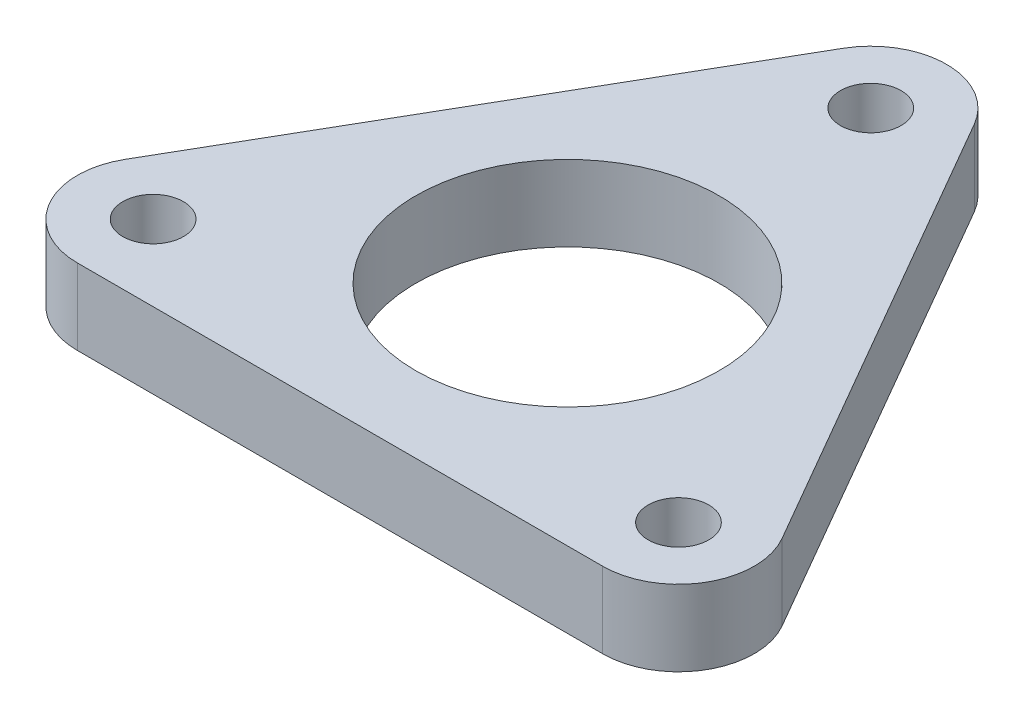
ISO-10303-21;
HEADER;
FILE_DESCRIPTION(('STEP AP214'),'2;1');
FILE_NAME('part.step','',(''),(''),'','','');
FILE_SCHEMA(('AUTOMOTIVE_DESIGN { 1 0 10303 214 1 1 1 1 }'));
ENDSEC;
DATA;
#1=APPLICATION_CONTEXT('core data for automotive mechanical design processes');
#2=APPLICATION_PROTOCOL_DEFINITION('international standard','automotive_design',2000,#1);
#3=PRODUCT_CONTEXT('',#1,'mechanical');
#4=PRODUCT('Part','Part','',(#3));
#5=PRODUCT_RELATED_PRODUCT_CATEGORY('part','',(#4));
#6=PRODUCT_DEFINITION_FORMATION('','',#4);
#7=PRODUCT_DEFINITION_CONTEXT('part definition',#1,'design');
#8=PRODUCT_DEFINITION('design','',#6,#7);
#9=PRODUCT_DEFINITION_SHAPE('','',#8);
#10=(LENGTH_UNIT() NAMED_UNIT(*) SI_UNIT(.MILLI.,.METRE.));
#11=(NAMED_UNIT(*) PLANE_ANGLE_UNIT() SI_UNIT($,.RADIAN.));
#12=(NAMED_UNIT(*) SI_UNIT($,.STERADIAN.) SOLID_ANGLE_UNIT());
#13=UNCERTAINTY_MEASURE_WITH_UNIT(LENGTH_MEASURE(1.E-05),#10,'distance_accuracy_value','');
#14=(GEOMETRIC_REPRESENTATION_CONTEXT(3) GLOBAL_UNCERTAINTY_ASSIGNED_CONTEXT((#13)) GLOBAL_UNIT_ASSIGNED_CONTEXT((#10,
#11,#12)) REPRESENTATION_CONTEXT('',''));
#15=CARTESIAN_POINT('',(0.,0.,0.));
#16=DIRECTION('',(0.,0.,1.));
#17=DIRECTION('',(1.,0.,0.));
#18=AXIS2_PLACEMENT_3D('',#15,#16,#17);
#19=CARTESIAN_POINT('',(34.6410161513775,10.,20.0000000000001));
#20=DIRECTION('',(0.,-1.,0.));
#21=DIRECTION('',(0.,0.,-1.));
#22=AXIS2_PLACEMENT_3D('',#19,#20,#21);
#23=CYLINDRICAL_SURFACE('',#22,10.);
#24=CARTESIAN_POINT('',(34.6410161513775,0.,20.0000000000001));
#25=DIRECTION('',(0.,1.,0.));
#26=DIRECTION('',(0.,0.,1.));
#27=AXIS2_PLACEMENT_3D('',#24,#25,#26);
#28=CIRCLE('',#27,10.);
#29=CARTESIAN_POINT('',(34.6410161513775,0.,30.0000000000001));
#30=VERTEX_POINT('',#29);
#31=CARTESIAN_POINT('',(43.3012701892219,0.,15.0000000000001));
#32=VERTEX_POINT('',#31);
#33=EDGE_CURVE('E129',#30,#32,#28,.T.);
#34=ORIENTED_EDGE('',*,*,#33,.T.);
#35=DIRECTION('',(0.,-1.,0.));
#36=VECTOR('',#35,1.);
#37=CARTESIAN_POINT('',(43.3012701892219,10.,15.0000000000001));
#38=LINE('',#37,#36);
#39=CARTESIAN_POINT('',(43.3012701892219,10.,15.0000000000001));
#40=VERTEX_POINT('',#39);
#41=EDGE_CURVE('E11',#40,#32,#38,.T.);
#42=ORIENTED_EDGE('',*,*,#41,.F.);
#43=CARTESIAN_POINT('',(34.6410161513775,10.,20.0000000000001));
#44=DIRECTION('',(0.,1.,0.));
#45=DIRECTION('',(0.,0.,1.));
#46=AXIS2_PLACEMENT_3D('',#43,#44,#45);
#47=CIRCLE('',#46,10.);
#48=CARTESIAN_POINT('',(34.6410161513775,10.,30.0000000000001));
#49=VERTEX_POINT('',#48);
#50=EDGE_CURVE('E81',#49,#40,#47,.T.);
#51=ORIENTED_EDGE('',*,*,#50,.F.);
#52=DIRECTION('',(0.,-1.,0.));
#53=VECTOR('',#52,1.);
#54=CARTESIAN_POINT('',(34.6410161513775,10.,30.0000000000001));
#55=LINE('',#54,#53);
#56=EDGE_CURVE('E128',#49,#30,#55,.T.);
#57=ORIENTED_EDGE('',*,*,#56,.T.);
#58=EDGE_LOOP('',(#34,#42,#51,#57));
#59=FACE_BOUND('',#58,.T.);
#60=ADVANCED_FACE('F35',(#59),#23,.T.);
#61=CARTESIAN_POINT('',(25.9807621135331,10.,-15.));
#62=DIRECTION('',(0.866025403784439,0.,-0.499999999999999));
#63=DIRECTION('',(-0.499999999999999,0.,-0.866025403784439));
#64=AXIS2_PLACEMENT_3D('',#61,#62,#63);
#65=PLANE('',#64);
#66=DIRECTION('',(0.499999999999999,0.,0.866025403784439));
#67=VECTOR('',#66,1.);
#68=CARTESIAN_POINT('',(25.9807621135331,0.,-15.));
#69=LINE('',#68,#67);
#70=CARTESIAN_POINT('',(8.66025403784438,0.,-45.));
#71=VERTEX_POINT('',#70);
#72=EDGE_CURVE('E132',#71,#32,#69,.T.);
#73=ORIENTED_EDGE('',*,*,#72,.F.);
#74=DIRECTION('',(0.,-1.,0.));
#75=VECTOR('',#74,1.);
#76=CARTESIAN_POINT('',(8.66025403784438,10.,-45.));
#77=LINE('',#76,#75);
#78=CARTESIAN_POINT('',(8.66025403784438,10.,-45.));
#79=VERTEX_POINT('',#78);
#80=EDGE_CURVE('E43',#79,#71,#77,.T.);
#81=ORIENTED_EDGE('',*,*,#80,.F.);
#82=DIRECTION('',(0.499999999999999,0.,0.866025403784439));
#83=VECTOR('',#82,1.);
#84=CARTESIAN_POINT('',(25.9807621135331,10.,-15.));
#85=LINE('',#84,#83);
#86=EDGE_CURVE('E337',#79,#40,#85,.T.);
#87=ORIENTED_EDGE('',*,*,#86,.T.);
#88=ORIENTED_EDGE('',*,*,#41,.T.);
#89=EDGE_LOOP('',(#73,#81,#87,#88));
#90=FACE_BOUND('',#89,.T.);
#91=ADVANCED_FACE('F162',(#90),#65,.T.);
#92=CARTESIAN_POINT('',(0.,10.,-40.));
#93=DIRECTION('',(0.,-1.,0.));
#94=DIRECTION('',(0.,0.,-1.));
#95=AXIS2_PLACEMENT_3D('',#92,#93,#94);
#96=CYLINDRICAL_SURFACE('',#95,9.99999999999999);
#97=CARTESIAN_POINT('',(0.,0.,-40.));
#98=DIRECTION('',(0.,1.,0.));
#99=DIRECTION('',(0.,0.,1.));
#100=AXIS2_PLACEMENT_3D('',#97,#98,#99);
#101=CIRCLE('',#100,9.99999999999999);
#102=CARTESIAN_POINT('',(-8.66025403784438,0.,-45.));
#103=VERTEX_POINT('',#102);
#104=EDGE_CURVE('E135',#103,#71,#101,.F.);
#105=ORIENTED_EDGE('',*,*,#104,.F.);
#106=DIRECTION('',(0.,-1.,0.));
#107=VECTOR('',#106,1.);
#108=CARTESIAN_POINT('',(-8.66025403784438,10.,-45.));
#109=LINE('',#108,#107);
#110=CARTESIAN_POINT('',(-8.66025403784438,10.,-45.));
#111=VERTEX_POINT('',#110);
#112=EDGE_CURVE('E102',#111,#103,#109,.T.);
#113=ORIENTED_EDGE('',*,*,#112,.F.);
#114=CARTESIAN_POINT('',(0.,10.,-40.));
#115=DIRECTION('',(0.,1.,0.));
#116=DIRECTION('',(0.,0.,1.));
#117=AXIS2_PLACEMENT_3D('',#114,#115,#116);
#118=CIRCLE('',#117,9.99999999999999);
#119=EDGE_CURVE('E109',#111,#79,#118,.F.);
#120=ORIENTED_EDGE('',*,*,#119,.T.);
#121=ORIENTED_EDGE('',*,*,#80,.T.);
#122=EDGE_LOOP('',(#105,#113,#120,#121));
#123=FACE_BOUND('',#122,.T.);
#124=ADVANCED_FACE('F159',(#123),#96,.T.);
#125=CARTESIAN_POINT('',(-25.9807621135332,10.,-15.));
#126=DIRECTION('',(-0.866025403784438,0.,-0.500000000000001));
#127=DIRECTION('',(-0.500000000000001,0.,0.866025403784438));
#128=AXIS2_PLACEMENT_3D('',#125,#126,#127);
#129=PLANE('',#128);
#130=DIRECTION('',(0.500000000000001,0.,-0.866025403784438));
#131=VECTOR('',#130,1.);
#132=CARTESIAN_POINT('',(-25.9807621135332,0.,-15.));
#133=LINE('',#132,#131);
#134=CARTESIAN_POINT('',(-43.301270189222,0.,15.));
#135=VERTEX_POINT('',#134);
#136=EDGE_CURVE('E97',#135,#103,#133,.T.);
#137=ORIENTED_EDGE('',*,*,#136,.F.);
#138=DIRECTION('',(0.,-1.,0.));
#139=VECTOR('',#138,1.);
#140=CARTESIAN_POINT('',(-43.301270189222,10.,15.));
#141=LINE('',#140,#139);
#142=CARTESIAN_POINT('',(-43.301270189222,10.,15.));
#143=VERTEX_POINT('',#142);
#144=EDGE_CURVE('E92',#143,#135,#141,.T.);
#145=ORIENTED_EDGE('',*,*,#144,.F.);
#146=DIRECTION('',(0.500000000000001,0.,-0.866025403784438));
#147=VECTOR('',#146,1.);
#148=CARTESIAN_POINT('',(-25.9807621135332,10.,-15.));
#149=LINE('',#148,#147);
#150=EDGE_CURVE('E95',#143,#111,#149,.T.);
#151=ORIENTED_EDGE('',*,*,#150,.T.);
#152=ORIENTED_EDGE('',*,*,#112,.T.);
#153=EDGE_LOOP('',(#137,#145,#151,#152));
#154=FACE_BOUND('',#153,.T.);
#155=ADVANCED_FACE('F94',(#154),#129,.T.);
#156=CARTESIAN_POINT('',(-34.6410161513775,10.,20.0000000000001));
#157=DIRECTION('',(0.,-1.,0.));
#158=DIRECTION('',(0.,0.,-1.));
#159=AXIS2_PLACEMENT_3D('',#156,#157,#158);
#160=CYLINDRICAL_SURFACE('',#159,10.0000000000001);
#161=CARTESIAN_POINT('',(-34.6410161513775,0.,20.0000000000001));
#162=DIRECTION('',(0.,1.,0.));
#163=DIRECTION('',(0.,0.,1.));
#164=AXIS2_PLACEMENT_3D('',#161,#162,#163);
#165=CIRCLE('',#164,10.0000000000001);
#166=CARTESIAN_POINT('',(-34.6410161513776,0.,30.0000000000001));
#167=VERTEX_POINT('',#166);
#168=EDGE_CURVE('E139',#167,#135,#165,.F.);
#169=ORIENTED_EDGE('',*,*,#168,.F.);
#170=DIRECTION('',(0.,-1.,0.));
#171=VECTOR('',#170,1.);
#172=CARTESIAN_POINT('',(-34.6410161513776,10.,30.0000000000001));
#173=LINE('',#172,#171);
#174=CARTESIAN_POINT('',(-34.6410161513776,10.,30.0000000000001));
#175=VERTEX_POINT('',#174);
#176=EDGE_CURVE('E72',#175,#167,#173,.T.);
#177=ORIENTED_EDGE('',*,*,#176,.F.);
#178=CARTESIAN_POINT('',(-34.6410161513775,10.,20.0000000000001));
#179=DIRECTION('',(0.,1.,0.));
#180=DIRECTION('',(0.,0.,1.));
#181=AXIS2_PLACEMENT_3D('',#178,#179,#180);
#182=CIRCLE('',#181,10.0000000000001);
#183=EDGE_CURVE('E107',#175,#143,#182,.F.);
#184=ORIENTED_EDGE('',*,*,#183,.T.);
#185=ORIENTED_EDGE('',*,*,#144,.T.);
#186=EDGE_LOOP('',(#169,#177,#184,#185));
#187=FACE_BOUND('',#186,.T.);
#188=ADVANCED_FACE('F111',(#187),#160,.T.);
#189=CARTESIAN_POINT('',(34.6410161513775,10.,20.0000000000001));
#190=DIRECTION('',(0.,-1.,0.));
#191=DIRECTION('',(0.,0.,-1.));
#192=AXIS2_PLACEMENT_3D('',#189,#190,#191);
#193=CYLINDRICAL_SURFACE('',#192,4.00000000000004);
#194=CARTESIAN_POINT('',(34.6410161513775,10.,20.0000000000001));
#195=DIRECTION('',(0.,1.,0.));
#196=DIRECTION('',(0.,0.,1.));
#197=AXIS2_PLACEMENT_3D('',#194,#195,#196);
#198=CIRCLE('',#197,4.00000000000004);
#199=CARTESIAN_POINT('',(34.6410161513775,10.,24.0000000000001));
#200=VERTEX_POINT('',#199);
#201=EDGE_CURVE('E122',#200,#200,#198,.T.);
#202=ORIENTED_EDGE('',*,*,#201,.T.);
#203=EDGE_LOOP('',(#202));
#204=FACE_BOUND('',#203,.T.);
#205=CARTESIAN_POINT('',(34.6410161513775,0.,20.0000000000001));
#206=DIRECTION('',(0.,1.,0.));
#207=DIRECTION('',(0.,0.,1.));
#208=AXIS2_PLACEMENT_3D('',#205,#206,#207);
#209=CIRCLE('',#208,4.00000000000004);
#210=CARTESIAN_POINT('',(34.6410161513775,0.,24.0000000000001));
#211=VERTEX_POINT('',#210);
#212=EDGE_CURVE('E148',#211,#211,#209,.T.);
#213=ORIENTED_EDGE('',*,*,#212,.F.);
#214=EDGE_LOOP('',(#213));
#215=FACE_BOUND('',#214,.T.);
#216=ADVANCED_FACE('F194',(#204,#215),#193,.F.);
#217=CARTESIAN_POINT('',(-34.6410161513775,10.,20.0000000000001));
#218=DIRECTION('',(0.,-1.,0.));
#219=DIRECTION('',(0.,0.,-1.));
#220=AXIS2_PLACEMENT_3D('',#217,#218,#219);
#221=CYLINDRICAL_SURFACE('',#220,4.);
#222=CARTESIAN_POINT('',(-34.6410161513775,10.,20.0000000000001));
#223=DIRECTION('',(0.,1.,0.));
#224=DIRECTION('',(0.,0.,1.));
#225=AXIS2_PLACEMENT_3D('',#222,#223,#224);
#226=CIRCLE('',#225,4.);
#227=CARTESIAN_POINT('',(-34.6410161513775,10.,24.));
#228=VERTEX_POINT('',#227);
#229=EDGE_CURVE('E119',#228,#228,#226,.T.);
#230=ORIENTED_EDGE('',*,*,#229,.T.);
#231=EDGE_LOOP('',(#230));
#232=FACE_BOUND('',#231,.T.);
#233=CARTESIAN_POINT('',(-34.6410161513775,0.,20.0000000000001));
#234=DIRECTION('',(0.,1.,0.));
#235=DIRECTION('',(0.,0.,1.));
#236=AXIS2_PLACEMENT_3D('',#233,#234,#235);
#237=CIRCLE('',#236,4.);
#238=CARTESIAN_POINT('',(-34.6410161513775,0.,24.));
#239=VERTEX_POINT('',#238);
#240=EDGE_CURVE('E145',#239,#239,#237,.T.);
#241=ORIENTED_EDGE('',*,*,#240,.F.);
#242=EDGE_LOOP('',(#241));
#243=FACE_BOUND('',#242,.T.);
#244=ADVANCED_FACE('F179',(#232,#243),#221,.F.);
#245=CARTESIAN_POINT('',(0.,10.,-40.));
#246=DIRECTION('',(0.,-1.,0.));
#247=DIRECTION('',(0.,0.,-1.));
#248=AXIS2_PLACEMENT_3D('',#245,#246,#247);
#249=CYLINDRICAL_SURFACE('',#248,4.);
#250=CARTESIAN_POINT('',(0.,10.,-40.));
#251=DIRECTION('',(0.,1.,0.));
#252=DIRECTION('',(0.,0.,1.));
#253=AXIS2_PLACEMENT_3D('',#250,#251,#252);
#254=CIRCLE('',#253,4.);
#255=CARTESIAN_POINT('',(0.,10.,-36.));
#256=VERTEX_POINT('',#255);
#257=EDGE_CURVE('E113',#256,#256,#254,.T.);
#258=ORIENTED_EDGE('',*,*,#257,.T.);
#259=EDGE_LOOP('',(#258));
#260=FACE_BOUND('',#259,.T.);
#261=CARTESIAN_POINT('',(0.,0.,-40.));
#262=DIRECTION('',(0.,1.,0.));
#263=DIRECTION('',(0.,0.,1.));
#264=AXIS2_PLACEMENT_3D('',#261,#262,#263);
#265=CIRCLE('',#264,4.);
#266=CARTESIAN_POINT('',(0.,0.,-36.));
#267=VERTEX_POINT('',#266);
#268=EDGE_CURVE('E142',#267,#267,#265,.T.);
#269=ORIENTED_EDGE('',*,*,#268,.F.);
#270=EDGE_LOOP('',(#269));
#271=FACE_BOUND('',#270,.T.);
#272=ADVANCED_FACE('F171',(#260,#271),#249,.F.);
#273=CARTESIAN_POINT('',(0.,10.,30.0000000000001));
#274=DIRECTION('',(0.,0.,-1.));
#275=DIRECTION('',(-1.,0.,0.));
#276=AXIS2_PLACEMENT_3D('',#273,#274,#275);
#277=PLANE('',#276);
#278=DIRECTION('',(1.,0.,0.));
#279=VECTOR('',#278,1.);
#280=CARTESIAN_POINT('',(0.,0.,30.0000000000001));
#281=LINE('',#280,#279);
#282=EDGE_CURVE('E75',#167,#30,#281,.T.);
#283=ORIENTED_EDGE('',*,*,#282,.T.);
#284=ORIENTED_EDGE('',*,*,#56,.F.);
#285=DIRECTION('',(1.,0.,0.));
#286=VECTOR('',#285,1.);
#287=CARTESIAN_POINT('',(0.,10.,30.0000000000001));
#288=LINE('',#287,#286);
#289=EDGE_CURVE('E51',#175,#49,#288,.T.);
#290=ORIENTED_EDGE('',*,*,#289,.F.);
#291=ORIENTED_EDGE('',*,*,#176,.T.);
#292=EDGE_LOOP('',(#283,#284,#290,#291));
#293=FACE_BOUND('',#292,.T.);
#294=ADVANCED_FACE('F168',(#293),#277,.F.);
#295=CARTESIAN_POINT('',(0.,10.,0.));
#296=DIRECTION('',(0.,-1.,0.));
#297=DIRECTION('',(0.,0.,-1.));
#298=AXIS2_PLACEMENT_3D('',#295,#296,#297);
#299=CYLINDRICAL_SURFACE('',#298,20.);
#300=CARTESIAN_POINT('',(0.,10.,0.));
#301=DIRECTION('',(0.,1.,0.));
#302=DIRECTION('',(0.,0.,1.));
#303=AXIS2_PLACEMENT_3D('',#300,#301,#302);
#304=CIRCLE('',#303,20.);
#305=CARTESIAN_POINT('',(0.,10.,20.));
#306=VERTEX_POINT('',#305);
#307=EDGE_CURVE('E125',#306,#306,#304,.T.);
#308=ORIENTED_EDGE('',*,*,#307,.T.);
#309=EDGE_LOOP('',(#308));
#310=FACE_BOUND('',#309,.T.);
#311=CARTESIAN_POINT('',(0.,0.,0.));
#312=DIRECTION('',(0.,1.,0.));
#313=DIRECTION('',(0.,0.,1.));
#314=AXIS2_PLACEMENT_3D('',#311,#312,#313);
#315=CIRCLE('',#314,20.);
#316=CARTESIAN_POINT('',(0.,0.,20.));
#317=VERTEX_POINT('',#316);
#318=EDGE_CURVE('E151',#317,#317,#315,.T.);
#319=ORIENTED_EDGE('',*,*,#318,.F.);
#320=EDGE_LOOP('',(#319));
#321=FACE_BOUND('',#320,.T.);
#322=ADVANCED_FACE('F170',(#310,#321),#299,.F.);
#323=CARTESIAN_POINT('',(0.,10.,0.));
#324=DIRECTION('',(0.,1.,0.));
#325=DIRECTION('',(0.,0.,1.));
#326=AXIS2_PLACEMENT_3D('',#323,#324,#325);
#327=PLANE('',#326);
#328=ORIENTED_EDGE('',*,*,#50,.T.);
#329=ORIENTED_EDGE('',*,*,#86,.F.);
#330=ORIENTED_EDGE('',*,*,#119,.F.);
#331=ORIENTED_EDGE('',*,*,#150,.F.);
#332=ORIENTED_EDGE('',*,*,#183,.F.);
#333=ORIENTED_EDGE('',*,*,#289,.T.);
#334=EDGE_LOOP('',(#328,#329,#330,#331,#332,#333));
#335=FACE_BOUND('',#334,.T.);
#336=ORIENTED_EDGE('',*,*,#257,.F.);
#337=EDGE_LOOP('',(#336));
#338=FACE_BOUND('',#337,.T.);
#339=ORIENTED_EDGE('',*,*,#229,.F.);
#340=EDGE_LOOP('',(#339));
#341=FACE_BOUND('',#340,.T.);
#342=ORIENTED_EDGE('',*,*,#201,.F.);
#343=EDGE_LOOP('',(#342));
#344=FACE_BOUND('',#343,.T.);
#345=ORIENTED_EDGE('',*,*,#307,.F.);
#346=EDGE_LOOP('',(#345));
#347=FACE_BOUND('',#346,.T.);
#348=ADVANCED_FACE('F105',(#335,#338,#341,#344,#347),#327,.T.);
#349=CARTESIAN_POINT('',(0.,0.,0.));
#350=DIRECTION('',(0.,1.,0.));
#351=DIRECTION('',(0.,0.,1.));
#352=AXIS2_PLACEMENT_3D('',#349,#350,#351);
#353=PLANE('',#352);
#354=ORIENTED_EDGE('',*,*,#33,.F.);
#355=ORIENTED_EDGE('',*,*,#282,.F.);
#356=ORIENTED_EDGE('',*,*,#168,.T.);
#357=ORIENTED_EDGE('',*,*,#136,.T.);
#358=ORIENTED_EDGE('',*,*,#104,.T.);
#359=ORIENTED_EDGE('',*,*,#72,.T.);
#360=EDGE_LOOP('',(#354,#355,#356,#357,#358,#359));
#361=FACE_BOUND('',#360,.T.);
#362=ORIENTED_EDGE('',*,*,#268,.T.);
#363=EDGE_LOOP('',(#362));
#364=FACE_BOUND('',#363,.T.);
#365=ORIENTED_EDGE('',*,*,#240,.T.);
#366=EDGE_LOOP('',(#365));
#367=FACE_BOUND('',#366,.T.);
#368=ORIENTED_EDGE('',*,*,#212,.T.);
#369=EDGE_LOOP('',(#368));
#370=FACE_BOUND('',#369,.T.);
#371=ORIENTED_EDGE('',*,*,#318,.T.);
#372=EDGE_LOOP('',(#371));
#373=FACE_BOUND('',#372,.T.);
#374=ADVANCED_FACE('F165',(#361,#364,#367,#370,#373),#353,.F.);
#375=CLOSED_SHELL('',(#60,#91,#124,#155,#188,#216,#244,#272,#294,#322,#348,#374));
#376=MANIFOLD_SOLID_BREP('B2',#375);
#377=ADVANCED_BREP_SHAPE_REPRESENTATION('',(#18,#376),#14);
#378=SHAPE_DEFINITION_REPRESENTATION(#9,#377);
ENDSEC;
END-ISO-10303-21;
